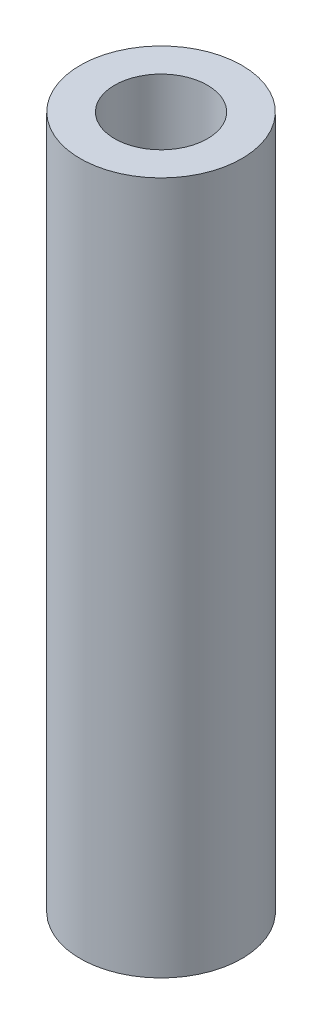
ISO-10303-21;
HEADER;
FILE_DESCRIPTION(('STEP AP214'),'2;1');
FILE_NAME('part.step','',(''),(''),'','','');
FILE_SCHEMA(('AUTOMOTIVE_DESIGN { 1 0 10303 214 1 1 1 1 }'));
ENDSEC;
DATA;
#1=APPLICATION_CONTEXT('core data for automotive mechanical design processes');
#2=APPLICATION_PROTOCOL_DEFINITION('international standard','automotive_design',2000,#1);
#3=PRODUCT_CONTEXT('',#1,'mechanical');
#4=PRODUCT('Part','Part','',(#3));
#5=PRODUCT_RELATED_PRODUCT_CATEGORY('part','',(#4));
#6=PRODUCT_DEFINITION_FORMATION('','',#4);
#7=PRODUCT_DEFINITION_CONTEXT('part definition',#1,'design');
#8=PRODUCT_DEFINITION('design','',#6,#7);
#9=PRODUCT_DEFINITION_SHAPE('','',#8);
#10=(LENGTH_UNIT() NAMED_UNIT(*) SI_UNIT(.MILLI.,.METRE.));
#11=(NAMED_UNIT(*) PLANE_ANGLE_UNIT() SI_UNIT($,.RADIAN.));
#12=(NAMED_UNIT(*) SI_UNIT($,.STERADIAN.) SOLID_ANGLE_UNIT());
#13=UNCERTAINTY_MEASURE_WITH_UNIT(LENGTH_MEASURE(1.E-05),#10,'distance_accuracy_value','');
#14=(GEOMETRIC_REPRESENTATION_CONTEXT(3) GLOBAL_UNCERTAINTY_ASSIGNED_CONTEXT((#13)) GLOBAL_UNIT_ASSIGNED_CONTEXT((#10,
#11,#12)) REPRESENTATION_CONTEXT('',''));
#15=CARTESIAN_POINT('',(0.,0.,0.));
#16=DIRECTION('',(0.,0.,1.));
#17=DIRECTION('',(1.,0.,0.));
#18=AXIS2_PLACEMENT_3D('',#15,#16,#17);
#19=CARTESIAN_POINT('',(0.,38.1,0.));
#20=DIRECTION('',(0.,1.,0.));
#21=DIRECTION('',(0.,0.,1.));
#22=AXIS2_PLACEMENT_3D('',#19,#20,#21);
#23=PLANE('',#22);
#24=CARTESIAN_POINT('',(0.,38.1,0.));
#25=DIRECTION('',(0.,1.,0.));
#26=DIRECTION('',(0.,0.,1.));
#27=AXIS2_PLACEMENT_3D('',#24,#25,#26);
#28=CIRCLE('',#27,4.445);
#29=CARTESIAN_POINT('',(0.,38.1,-4.445));
#30=VERTEX_POINT('',#29);
#31=EDGE_CURVE('E10',#30,#30,#28,.T.);
#32=ORIENTED_EDGE('',*,*,#31,.T.);
#33=EDGE_LOOP('',(#32));
#34=FACE_BOUND('',#33,.T.);
#35=CARTESIAN_POINT('',(0.,38.1,0.));
#36=DIRECTION('',(0.,1.,0.));
#37=DIRECTION('',(0.,0.,1.));
#38=AXIS2_PLACEMENT_3D('',#35,#36,#37);
#39=CIRCLE('',#38,2.5527);
#40=CARTESIAN_POINT('',(0.,38.1,-2.5527));
#41=VERTEX_POINT('',#40);
#42=EDGE_CURVE('E42',#41,#41,#39,.T.);
#43=ORIENTED_EDGE('',*,*,#42,.F.);
#44=EDGE_LOOP('',(#43));
#45=FACE_BOUND('',#44,.T.);
#46=ADVANCED_FACE('F31',(#34,#45),#23,.T.);
#47=CARTESIAN_POINT('',(0.,0.,0.));
#48=DIRECTION('',(0.,1.,0.));
#49=DIRECTION('',(0.,0.,1.));
#50=AXIS2_PLACEMENT_3D('',#47,#48,#49);
#51=PLANE('',#50);
#52=CARTESIAN_POINT('',(0.,0.,0.));
#53=DIRECTION('',(0.,1.,0.));
#54=DIRECTION('',(0.,0.,1.));
#55=AXIS2_PLACEMENT_3D('',#52,#53,#54);
#56=CIRCLE('',#55,4.445);
#57=CARTESIAN_POINT('',(0.,0.,-4.445));
#58=VERTEX_POINT('',#57);
#59=EDGE_CURVE('E35',#58,#58,#56,.T.);
#60=ORIENTED_EDGE('',*,*,#59,.F.);
#61=EDGE_LOOP('',(#60));
#62=FACE_BOUND('',#61,.T.);
#63=CARTESIAN_POINT('',(0.,0.,0.));
#64=DIRECTION('',(0.,1.,0.));
#65=DIRECTION('',(0.,0.,1.));
#66=AXIS2_PLACEMENT_3D('',#63,#64,#65);
#67=CIRCLE('',#66,2.5527);
#68=CARTESIAN_POINT('',(0.,0.,-2.5527));
#69=VERTEX_POINT('',#68);
#70=EDGE_CURVE('E44',#69,#69,#67,.T.);
#71=ORIENTED_EDGE('',*,*,#70,.T.);
#72=EDGE_LOOP('',(#71));
#73=FACE_BOUND('',#72,.T.);
#74=ADVANCED_FACE('F54',(#62,#73),#51,.F.);
#75=CARTESIAN_POINT('',(0.,38.1,0.));
#76=DIRECTION('',(0.,-1.,0.));
#77=DIRECTION('',(0.,0.,-1.));
#78=AXIS2_PLACEMENT_3D('',#75,#76,#77);
#79=CYLINDRICAL_SURFACE('',#78,4.445);
#80=CARTESIAN_POINT('',(0.,38.1,-4.445));
#81=CARTESIAN_POINT('',(0.,37.703125,-4.445));
#82=CARTESIAN_POINT('',(0.,37.30625,-4.445));
#83=CARTESIAN_POINT('',(0.,36.5125,-4.445));
#84=CARTESIAN_POINT('',(0.,36.115625,-4.445));
#85=CARTESIAN_POINT('',(0.,35.321875,-4.445));
#86=CARTESIAN_POINT('',(0.,34.925,-4.445));
#87=CARTESIAN_POINT('',(0.,34.13125,-4.445));
#88=CARTESIAN_POINT('',(0.,33.734375,-4.445));
#89=CARTESIAN_POINT('',(0.,32.940625,-4.445));
#90=CARTESIAN_POINT('',(0.,32.54375,-4.445));
#91=CARTESIAN_POINT('',(0.,31.75,-4.445));
#92=CARTESIAN_POINT('',(0.,31.353125,-4.445));
#93=CARTESIAN_POINT('',(0.,30.559375,-4.445));
#94=CARTESIAN_POINT('',(0.,30.1625,-4.445));
#95=CARTESIAN_POINT('',(0.,29.36875,-4.445));
#96=CARTESIAN_POINT('',(0.,28.971875,-4.445));
#97=CARTESIAN_POINT('',(0.,28.178125,-4.445));
#98=CARTESIAN_POINT('',(0.,27.78125,-4.445));
#99=CARTESIAN_POINT('',(0.,26.9875,-4.445));
#100=CARTESIAN_POINT('',(0.,26.590625,-4.445));
#101=CARTESIAN_POINT('',(0.,25.796875,-4.445));
#102=CARTESIAN_POINT('',(0.,25.4,-4.445));
#103=CARTESIAN_POINT('',(0.,24.60625,-4.445));
#104=CARTESIAN_POINT('',(0.,24.209375,-4.445));
#105=CARTESIAN_POINT('',(0.,23.415625,-4.445));
#106=CARTESIAN_POINT('',(0.,23.01875,-4.445));
#107=CARTESIAN_POINT('',(0.,22.225,-4.445));
#108=CARTESIAN_POINT('',(0.,21.828125,-4.445));
#109=CARTESIAN_POINT('',(0.,21.034375,-4.445));
#110=CARTESIAN_POINT('',(0.,20.6375,-4.445));
#111=CARTESIAN_POINT('',(0.,19.84375,-4.445));
#112=CARTESIAN_POINT('',(0.,19.446875,-4.445));
#113=CARTESIAN_POINT('',(0.,18.653125,-4.445));
#114=CARTESIAN_POINT('',(0.,18.25625,-4.445));
#115=CARTESIAN_POINT('',(0.,17.4625,-4.445));
#116=CARTESIAN_POINT('',(0.,17.065625,-4.445));
#117=CARTESIAN_POINT('',(0.,16.271875,-4.445));
#118=CARTESIAN_POINT('',(0.,15.875,-4.445));
#119=CARTESIAN_POINT('',(0.,15.08125,-4.445));
#120=CARTESIAN_POINT('',(0.,14.684375,-4.445));
#121=CARTESIAN_POINT('',(0.,13.890625,-4.445));
#122=CARTESIAN_POINT('',(0.,13.49375,-4.445));
#123=CARTESIAN_POINT('',(0.,12.7,-4.445));
#124=CARTESIAN_POINT('',(0.,12.303125,-4.445));
#125=CARTESIAN_POINT('',(0.,11.509375,-4.445));
#126=CARTESIAN_POINT('',(0.,11.1125,-4.445));
#127=CARTESIAN_POINT('',(0.,10.31875,-4.445));
#128=CARTESIAN_POINT('',(0.,9.921875,-4.445));
#129=CARTESIAN_POINT('',(0.,9.128125,-4.445));
#130=CARTESIAN_POINT('',(0.,8.73125,-4.445));
#131=CARTESIAN_POINT('',(0.,7.9375,-4.445));
#132=CARTESIAN_POINT('',(0.,7.540625,-4.445));
#133=CARTESIAN_POINT('',(0.,6.746875,-4.445));
#134=CARTESIAN_POINT('',(0.,6.35,-4.445));
#135=CARTESIAN_POINT('',(0.,5.55625,-4.445));
#136=CARTESIAN_POINT('',(0.,5.159375,-4.445));
#137=CARTESIAN_POINT('',(0.,4.365625,-4.445));
#138=CARTESIAN_POINT('',(0.,3.96875,-4.445));
#139=CARTESIAN_POINT('',(0.,3.175,-4.445));
#140=CARTESIAN_POINT('',(0.,2.778125,-4.445));
#141=CARTESIAN_POINT('',(0.,1.984375,-4.445));
#142=CARTESIAN_POINT('',(0.,1.5875,-4.445));
#143=CARTESIAN_POINT('',(0.,0.79375,-4.445));
#144=CARTESIAN_POINT('',(0.,0.396875,-4.445));
#145=CARTESIAN_POINT('',(0.,0.,-4.445));
#146=B_SPLINE_CURVE_WITH_KNOTS('',3,(#80,#81,#82,#83,#84,#85,#86,#87,#88,#89,#90,#91,#92,#93,
#94,#95,#96,#97,#98,#99,#100,#101,#102,#103,#104,#105,#106,#107,#108,#109,#110,#111,#112,#113,
#114,#115,#116,#117,#118,#119,#120,#121,#122,#123,#124,#125,#126,#127,#128,#129,#130,#131,#132,
#133,#134,#135,#136,#137,#138,#139,#140,#141,#142,#143,#144,#145),.UNSPECIFIED.,.F.,.F.,(4,2,2,
2,2,2,2,2,2,2,2,2,2,2,2,2,2,2,2,2,2,2,2,2,2,2,2,2,2,2,2,2,4),(0.,1.19062499999999,
2.38124999999999,3.571875,4.7625,5.953125,7.14375,8.33437499999999,9.525,10.715625,11.90625,
13.096875,14.2875,15.478125,16.66875,17.859375,19.05,20.240625,21.43125,22.621875,23.8125,
25.003125,26.19375,27.384375,28.575,29.765625,30.95625,32.146875,33.3375,34.528125,35.71875,
36.909375,38.1),.UNSPECIFIED.);
#147=EDGE_CURVE('BSEAM33',#30,#58,#146,.T.);
#148=ORIENTED_EDGE('',*,*,#31,.F.);
#149=ORIENTED_EDGE('',*,*,#59,.T.);
#150=ORIENTED_EDGE('',*,*,#147,.T.);
#151=ORIENTED_EDGE('',*,*,#147,.F.);
#152=EDGE_LOOP('',(#148,#150,#149,#151));
#153=FACE_BOUND('',#152,.T.);
#154=ADVANCED_FACE('F33',(#153),#79,.T.);
#155=CARTESIAN_POINT('',(0.,38.1,0.));
#156=DIRECTION('',(0.,-1.,0.));
#157=DIRECTION('',(0.,0.,-1.));
#158=AXIS2_PLACEMENT_3D('',#155,#156,#157);
#159=CYLINDRICAL_SURFACE('',#158,2.5527);
#160=CARTESIAN_POINT('',(0.,38.1,-2.5527));
#161=CARTESIAN_POINT('',(0.,37.703125,-2.5527));
#162=CARTESIAN_POINT('',(0.,37.30625,-2.5527));
#163=CARTESIAN_POINT('',(0.,36.5125,-2.5527));
#164=CARTESIAN_POINT('',(0.,36.115625,-2.5527));
#165=CARTESIAN_POINT('',(0.,35.321875,-2.5527));
#166=CARTESIAN_POINT('',(0.,34.925,-2.5527));
#167=CARTESIAN_POINT('',(0.,34.13125,-2.5527));
#168=CARTESIAN_POINT('',(0.,33.734375,-2.5527));
#169=CARTESIAN_POINT('',(0.,32.940625,-2.5527));
#170=CARTESIAN_POINT('',(0.,32.54375,-2.5527));
#171=CARTESIAN_POINT('',(0.,31.75,-2.5527));
#172=CARTESIAN_POINT('',(0.,31.353125,-2.5527));
#173=CARTESIAN_POINT('',(0.,30.559375,-2.5527));
#174=CARTESIAN_POINT('',(0.,30.1625,-2.5527));
#175=CARTESIAN_POINT('',(0.,29.36875,-2.5527));
#176=CARTESIAN_POINT('',(0.,28.971875,-2.5527));
#177=CARTESIAN_POINT('',(0.,28.178125,-2.5527));
#178=CARTESIAN_POINT('',(0.,27.78125,-2.5527));
#179=CARTESIAN_POINT('',(0.,26.9875,-2.5527));
#180=CARTESIAN_POINT('',(0.,26.590625,-2.5527));
#181=CARTESIAN_POINT('',(0.,25.796875,-2.5527));
#182=CARTESIAN_POINT('',(0.,25.4,-2.5527));
#183=CARTESIAN_POINT('',(0.,24.60625,-2.5527));
#184=CARTESIAN_POINT('',(0.,24.209375,-2.5527));
#185=CARTESIAN_POINT('',(0.,23.415625,-2.5527));
#186=CARTESIAN_POINT('',(0.,23.01875,-2.5527));
#187=CARTESIAN_POINT('',(0.,22.225,-2.5527));
#188=CARTESIAN_POINT('',(0.,21.828125,-2.5527));
#189=CARTESIAN_POINT('',(0.,21.034375,-2.5527));
#190=CARTESIAN_POINT('',(0.,20.6375,-2.5527));
#191=CARTESIAN_POINT('',(0.,19.84375,-2.5527));
#192=CARTESIAN_POINT('',(0.,19.446875,-2.5527));
#193=CARTESIAN_POINT('',(0.,18.653125,-2.5527));
#194=CARTESIAN_POINT('',(0.,18.25625,-2.5527));
#195=CARTESIAN_POINT('',(0.,17.4625,-2.5527));
#196=CARTESIAN_POINT('',(0.,17.065625,-2.5527));
#197=CARTESIAN_POINT('',(0.,16.271875,-2.5527));
#198=CARTESIAN_POINT('',(0.,15.875,-2.5527));
#199=CARTESIAN_POINT('',(0.,15.08125,-2.5527));
#200=CARTESIAN_POINT('',(0.,14.684375,-2.5527));
#201=CARTESIAN_POINT('',(0.,13.890625,-2.5527));
#202=CARTESIAN_POINT('',(0.,13.49375,-2.5527));
#203=CARTESIAN_POINT('',(0.,12.7,-2.5527));
#204=CARTESIAN_POINT('',(0.,12.303125,-2.5527));
#205=CARTESIAN_POINT('',(0.,11.509375,-2.5527));
#206=CARTESIAN_POINT('',(0.,11.1125,-2.5527));
#207=CARTESIAN_POINT('',(0.,10.31875,-2.5527));
#208=CARTESIAN_POINT('',(0.,9.921875,-2.5527));
#209=CARTESIAN_POINT('',(0.,9.128125,-2.5527));
#210=CARTESIAN_POINT('',(0.,8.73125,-2.5527));
#211=CARTESIAN_POINT('',(0.,7.9375,-2.5527));
#212=CARTESIAN_POINT('',(0.,7.540625,-2.5527));
#213=CARTESIAN_POINT('',(0.,6.746875,-2.5527));
#214=CARTESIAN_POINT('',(0.,6.35,-2.5527));
#215=CARTESIAN_POINT('',(0.,5.55625,-2.5527));
#216=CARTESIAN_POINT('',(0.,5.159375,-2.5527));
#217=CARTESIAN_POINT('',(0.,4.365625,-2.5527));
#218=CARTESIAN_POINT('',(0.,3.96875,-2.5527));
#219=CARTESIAN_POINT('',(0.,3.175,-2.5527));
#220=CARTESIAN_POINT('',(0.,2.778125,-2.5527));
#221=CARTESIAN_POINT('',(0.,1.984375,-2.5527));
#222=CARTESIAN_POINT('',(0.,1.5875,-2.5527));
#223=CARTESIAN_POINT('',(0.,0.79375,-2.5527));
#224=CARTESIAN_POINT('',(0.,0.396875,-2.5527));
#225=CARTESIAN_POINT('',(0.,0.,-2.5527));
#226=B_SPLINE_CURVE_WITH_KNOTS('',3,(#160,#161,#162,#163,#164,#165,#166,#167,#168,#169,#170,
#171,#172,#173,#174,#175,#176,#177,#178,#179,#180,#181,#182,#183,#184,#185,#186,#187,#188,#189,
#190,#191,#192,#193,#194,#195,#196,#197,#198,#199,#200,#201,#202,#203,#204,#205,#206,#207,#208,
#209,#210,#211,#212,#213,#214,#215,#216,#217,#218,#219,#220,#221,#222,#223,#224,#225),
.UNSPECIFIED.,.F.,.F.,(4,2,2,2,2,2,2,2,2,2,2,2,2,2,2,2,2,2,2,2,2,2,2,2,2,2,2,2,2,2,2,2,4),(0.,
1.19062499999999,2.38124999999999,3.571875,4.7625,5.953125,7.14375,8.33437499999999,9.525,
10.715625,11.90625,13.096875,14.2875,15.478125,16.66875,17.859375,19.05,20.240625,21.43125,
22.621875,23.8125,25.003125,26.19375,27.384375,28.575,29.765625,30.95625,32.146875,33.3375,
34.528125,35.71875,36.909375,38.1),.UNSPECIFIED.);
#227=EDGE_CURVE('BSEAM50',#41,#69,#226,.T.);
#228=ORIENTED_EDGE('',*,*,#42,.T.);
#229=ORIENTED_EDGE('',*,*,#70,.F.);
#230=ORIENTED_EDGE('',*,*,#227,.T.);
#231=ORIENTED_EDGE('',*,*,#227,.F.);
#232=EDGE_LOOP('',(#228,#230,#229,#231));
#233=FACE_BOUND('',#232,.T.);
#234=ADVANCED_FACE('F50',(#233),#159,.F.);
#235=CLOSED_SHELL('',(#46,#74,#154,#234));
#236=MANIFOLD_SOLID_BREP('B2',#235);
#237=ADVANCED_BREP_SHAPE_REPRESENTATION('',(#18,#236),#14);
#238=SHAPE_DEFINITION_REPRESENTATION(#9,#237);
ENDSEC;
END-ISO-10303-21;
